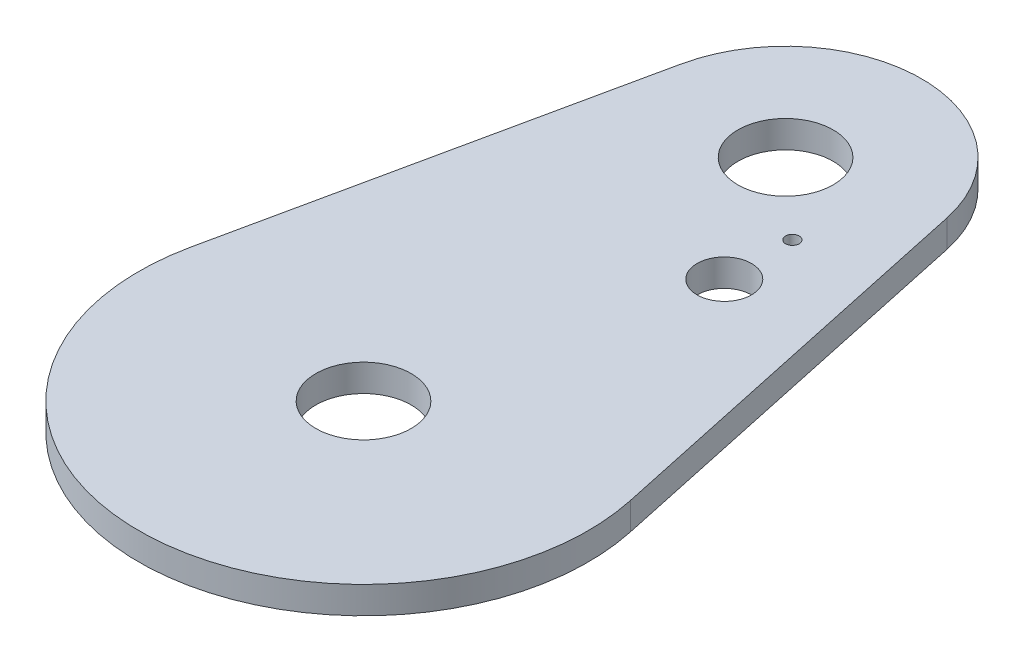
ISO-10303-21;
HEADER;
FILE_DESCRIPTION(('STEP AP214'),'2;1');
FILE_NAME('part.step','',(''),(''),'','','');
FILE_SCHEMA(('AUTOMOTIVE_DESIGN { 1 0 10303 214 1 1 1 1 }'));
ENDSEC;
DATA;
#1=APPLICATION_CONTEXT('core data for automotive mechanical design processes');
#2=APPLICATION_PROTOCOL_DEFINITION('international standard','automotive_design',2000,#1);
#3=PRODUCT_CONTEXT('',#1,'mechanical');
#4=PRODUCT('Part','Part','',(#3));
#5=PRODUCT_RELATED_PRODUCT_CATEGORY('part','',(#4));
#6=PRODUCT_DEFINITION_FORMATION('','',#4);
#7=PRODUCT_DEFINITION_CONTEXT('part definition',#1,'design');
#8=PRODUCT_DEFINITION('design','',#6,#7);
#9=PRODUCT_DEFINITION_SHAPE('','',#8);
#10=(LENGTH_UNIT() NAMED_UNIT(*) SI_UNIT(.MILLI.,.METRE.));
#11=(NAMED_UNIT(*) PLANE_ANGLE_UNIT() SI_UNIT($,.RADIAN.));
#12=(NAMED_UNIT(*) SI_UNIT($,.STERADIAN.) SOLID_ANGLE_UNIT());
#13=UNCERTAINTY_MEASURE_WITH_UNIT(LENGTH_MEASURE(1.E-05),#10,'distance_accuracy_value','');
#14=(GEOMETRIC_REPRESENTATION_CONTEXT(3) GLOBAL_UNCERTAINTY_ASSIGNED_CONTEXT((#13)) GLOBAL_UNIT_ASSIGNED_CONTEXT((#10,
#11,#12)) REPRESENTATION_CONTEXT('',''));
#15=CARTESIAN_POINT('',(0.,0.,0.));
#16=DIRECTION('',(0.,0.,1.));
#17=DIRECTION('',(1.,0.,0.));
#18=AXIS2_PLACEMENT_3D('',#15,#16,#17);
#19=CARTESIAN_POINT('',(0.,-4.,-62.));
#20=DIRECTION('',(0.,1.,0.));
#21=DIRECTION('',(0.,0.,1.));
#22=AXIS2_PLACEMENT_3D('',#19,#20,#21);
#23=CYLINDRICAL_SURFACE('',#22,20.);
#24=CARTESIAN_POINT('',(0.,0.,-62.));
#25=DIRECTION('',(0.,1.,0.));
#26=DIRECTION('',(0.,0.,1.));
#27=AXIS2_PLACEMENT_3D('',#24,#25,#26);
#28=CIRCLE('',#27,20.);
#29=CARTESIAN_POINT('',(19.5554123435196,0.,-66.1935483870968));
#30=VERTEX_POINT('',#29);
#31=CARTESIAN_POINT('',(-19.5554123435196,0.,-66.1935483870968));
#32=VERTEX_POINT('',#31);
#33=EDGE_CURVE('E100',#30,#32,#28,.T.);
#34=ORIENTED_EDGE('',*,*,#33,.F.);
#35=DIRECTION('',(0.,1.,0.));
#36=VECTOR('',#35,1.);
#37=CARTESIAN_POINT('',(19.5554123435196,-4.,-66.1935483870968));
#38=LINE('',#37,#36);
#39=CARTESIAN_POINT('',(19.5554123435196,-4.,-66.1935483870968));
#40=VERTEX_POINT('',#39);
#41=EDGE_CURVE('E11',#40,#30,#38,.T.);
#42=ORIENTED_EDGE('',*,*,#41,.F.);
#43=CARTESIAN_POINT('',(0.,-4.,-62.));
#44=DIRECTION('',(0.,1.,0.));
#45=DIRECTION('',(0.,0.,1.));
#46=AXIS2_PLACEMENT_3D('',#43,#44,#45);
#47=CIRCLE('',#46,20.);
#48=CARTESIAN_POINT('',(-19.5554123435196,-4.,-66.1935483870968));
#49=VERTEX_POINT('',#48);
#50=EDGE_CURVE('E93',#40,#49,#47,.T.);
#51=ORIENTED_EDGE('',*,*,#50,.T.);
#52=DIRECTION('',(0.,1.,0.));
#53=VECTOR('',#52,1.);
#54=CARTESIAN_POINT('',(-19.5554123435196,-4.,-66.1935483870968));
#55=LINE('',#54,#53);
#56=EDGE_CURVE('E38',#49,#32,#55,.T.);
#57=ORIENTED_EDGE('',*,*,#56,.T.);
#58=EDGE_LOOP('',(#34,#42,#51,#57));
#59=FACE_BOUND('',#58,.T.);
#60=ADVANCED_FACE('F35',(#59),#23,.T.);
#61=CARTESIAN_POINT('',(19.5554123435196,-4.,-66.1935483870968));
#62=DIRECTION('',(0.977770617175979,0.,-0.209677419354839));
#63=DIRECTION('',(-0.209677419354839,0.,-0.977770617175979));
#64=AXIS2_PLACEMENT_3D('',#61,#62,#63);
#65=PLANE('',#64);
#66=DIRECTION('',(-0.209677419354839,0.,-0.977770617175979));
#67=VECTOR('',#66,1.);
#68=CARTESIAN_POINT('',(19.5554123435196,0.,-66.1935483870968));
#69=LINE('',#68,#67);
#70=CARTESIAN_POINT('',(32.2664303668073,0.,-6.91935483870969));
#71=VERTEX_POINT('',#70);
#72=EDGE_CURVE('E95',#71,#30,#69,.T.);
#73=ORIENTED_EDGE('',*,*,#72,.F.);
#74=DIRECTION('',(0.,1.,0.));
#75=VECTOR('',#74,1.);
#76=CARTESIAN_POINT('',(32.2664303668073,-4.,-6.91935483870969));
#77=LINE('',#76,#75);
#78=CARTESIAN_POINT('',(32.2664303668073,-4.,-6.91935483870969));
#79=VERTEX_POINT('',#78);
#80=EDGE_CURVE('E44',#79,#71,#77,.T.);
#81=ORIENTED_EDGE('',*,*,#80,.F.);
#82=DIRECTION('',(-0.209677419354839,0.,-0.977770617175979));
#83=VECTOR('',#82,1.);
#84=CARTESIAN_POINT('',(19.5554123435196,-4.,-66.1935483870968));
#85=LINE('',#84,#83);
#86=EDGE_CURVE('E90',#79,#40,#85,.T.);
#87=ORIENTED_EDGE('',*,*,#86,.T.);
#88=ORIENTED_EDGE('',*,*,#41,.T.);
#89=EDGE_LOOP('',(#73,#81,#87,#88));
#90=FACE_BOUND('',#89,.T.);
#91=ADVANCED_FACE('F111',(#90),#65,.T.);
#92=CARTESIAN_POINT('',(0.,-4.,0.));
#93=DIRECTION('',(0.,1.,0.));
#94=DIRECTION('',(0.,0.,1.));
#95=AXIS2_PLACEMENT_3D('',#92,#93,#94);
#96=CYLINDRICAL_SURFACE('',#95,33.);
#97=CARTESIAN_POINT('',(0.,0.,0.));
#98=DIRECTION('',(0.,1.,0.));
#99=DIRECTION('',(0.,0.,1.));
#100=AXIS2_PLACEMENT_3D('',#97,#98,#99);
#101=CIRCLE('',#100,33.);
#102=CARTESIAN_POINT('',(-32.2664303668073,0.,-6.91935483870968));
#103=VERTEX_POINT('',#102);
#104=EDGE_CURVE('E85',#103,#71,#101,.T.);
#105=ORIENTED_EDGE('',*,*,#104,.F.);
#106=DIRECTION('',(0.,1.,0.));
#107=VECTOR('',#106,1.);
#108=CARTESIAN_POINT('',(-32.2664303668073,-4.,-6.91935483870968));
#109=LINE('',#108,#107);
#110=CARTESIAN_POINT('',(-32.2664303668073,-4.,-6.91935483870968));
#111=VERTEX_POINT('',#110);
#112=EDGE_CURVE('E80',#111,#103,#109,.T.);
#113=ORIENTED_EDGE('',*,*,#112,.F.);
#114=CARTESIAN_POINT('',(0.,-4.,0.));
#115=DIRECTION('',(0.,1.,0.));
#116=DIRECTION('',(0.,0.,1.));
#117=AXIS2_PLACEMENT_3D('',#114,#115,#116);
#118=CIRCLE('',#117,33.);
#119=EDGE_CURVE('E83',#111,#79,#118,.T.);
#120=ORIENTED_EDGE('',*,*,#119,.T.);
#121=ORIENTED_EDGE('',*,*,#80,.T.);
#122=EDGE_LOOP('',(#105,#113,#120,#121));
#123=FACE_BOUND('',#122,.T.);
#124=ADVANCED_FACE('F82',(#123),#96,.T.);
#125=CARTESIAN_POINT('',(-19.5554123435196,-4.,-66.1935483870968));
#126=DIRECTION('',(-0.977770617175979,0.,-0.209677419354839));
#127=DIRECTION('',(-0.209677419354839,0.,0.977770617175979));
#128=AXIS2_PLACEMENT_3D('',#125,#126,#127);
#129=PLANE('',#128);
#130=DIRECTION('',(-0.209677419354839,0.,0.977770617175979));
#131=VECTOR('',#130,1.);
#132=CARTESIAN_POINT('',(-19.5554123435196,0.,-66.1935483870968));
#133=LINE('',#132,#131);
#134=EDGE_CURVE('E103',#32,#103,#133,.T.);
#135=ORIENTED_EDGE('',*,*,#134,.F.);
#136=ORIENTED_EDGE('',*,*,#56,.F.);
#137=DIRECTION('',(-0.209677419354839,0.,0.977770617175979));
#138=VECTOR('',#137,1.);
#139=CARTESIAN_POINT('',(-19.5554123435196,-4.,-66.1935483870968));
#140=LINE('',#139,#138);
#141=EDGE_CURVE('E89',#49,#111,#140,.T.);
#142=ORIENTED_EDGE('',*,*,#141,.T.);
#143=ORIENTED_EDGE('',*,*,#112,.T.);
#144=EDGE_LOOP('',(#135,#136,#142,#143));
#145=FACE_BOUND('',#144,.T.);
#146=ADVANCED_FACE('F92',(#145),#129,.T.);
#147=CARTESIAN_POINT('',(0.,-4.,-62.));
#148=DIRECTION('',(0.,1.,0.));
#149=DIRECTION('',(0.,0.,1.));
#150=AXIS2_PLACEMENT_3D('',#147,#148,#149);
#151=PLANE('',#150);
#152=CARTESIAN_POINT('',(11.,-4.,-42.));
#153=DIRECTION('',(0.,1.,0.));
#154=DIRECTION('',(0.,0.,1.));
#155=AXIS2_PLACEMENT_3D('',#152,#153,#154);
#156=CIRCLE('',#155,4.);
#157=CARTESIAN_POINT('',(11.,-4.,-38.));
#158=VERTEX_POINT('',#157);
#159=EDGE_CURVE('E152',#158,#158,#156,.T.);
#160=ORIENTED_EDGE('',*,*,#159,.T.);
#161=EDGE_LOOP('',(#160));
#162=FACE_BOUND('',#161,.T.);
#163=CARTESIAN_POINT('',(11.,-4.,-52.));
#164=DIRECTION('',(0.,1.,0.));
#165=DIRECTION('',(0.,0.,1.));
#166=AXIS2_PLACEMENT_3D('',#163,#164,#165);
#167=CIRCLE('',#166,1.);
#168=CARTESIAN_POINT('',(11.,-4.,-51.));
#169=VERTEX_POINT('',#168);
#170=EDGE_CURVE('E160',#169,#169,#167,.T.);
#171=ORIENTED_EDGE('',*,*,#170,.T.);
#172=EDGE_LOOP('',(#171));
#173=FACE_BOUND('',#172,.T.);
#174=CARTESIAN_POINT('',(0.,-4.,-62.));
#175=DIRECTION('',(0.,1.,0.));
#176=DIRECTION('',(0.,0.,1.));
#177=AXIS2_PLACEMENT_3D('',#174,#175,#176);
#178=CIRCLE('',#177,7.);
#179=CARTESIAN_POINT('',(0.,-4.,-55.));
#180=VERTEX_POINT('',#179);
#181=EDGE_CURVE('E166',#180,#180,#178,.T.);
#182=ORIENTED_EDGE('',*,*,#181,.T.);
#183=EDGE_LOOP('',(#182));
#184=FACE_BOUND('',#183,.T.);
#185=CARTESIAN_POINT('',(0.,-4.,0.));
#186=DIRECTION('',(0.,1.,0.));
#187=DIRECTION('',(0.,0.,1.));
#188=AXIS2_PLACEMENT_3D('',#185,#186,#187);
#189=CIRCLE('',#188,7.);
#190=CARTESIAN_POINT('',(0.,-4.,7.));
#191=VERTEX_POINT('',#190);
#192=EDGE_CURVE('E104',#191,#191,#189,.T.);
#193=ORIENTED_EDGE('',*,*,#192,.T.);
#194=EDGE_LOOP('',(#193));
#195=FACE_BOUND('',#194,.T.);
#196=ORIENTED_EDGE('',*,*,#50,.F.);
#197=ORIENTED_EDGE('',*,*,#86,.F.);
#198=ORIENTED_EDGE('',*,*,#119,.F.);
#199=ORIENTED_EDGE('',*,*,#141,.F.);
#200=EDGE_LOOP('',(#196,#197,#198,#199));
#201=FACE_BOUND('',#200,.T.);
#202=ADVANCED_FACE('F88',(#162,#173,#184,#195,#201),#151,.F.);
#203=CARTESIAN_POINT('',(0.,0.,-62.));
#204=DIRECTION('',(0.,1.,0.));
#205=DIRECTION('',(0.,0.,1.));
#206=AXIS2_PLACEMENT_3D('',#203,#204,#205);
#207=PLANE('',#206);
#208=CARTESIAN_POINT('',(11.,0.,-42.));
#209=DIRECTION('',(0.,1.,0.));
#210=DIRECTION('',(0.,0.,1.));
#211=AXIS2_PLACEMENT_3D('',#208,#209,#210);
#212=CIRCLE('',#211,4.);
#213=CARTESIAN_POINT('',(11.,0.,-38.));
#214=VERTEX_POINT('',#213);
#215=EDGE_CURVE('E155',#214,#214,#212,.T.);
#216=ORIENTED_EDGE('',*,*,#215,.F.);
#217=EDGE_LOOP('',(#216));
#218=FACE_BOUND('',#217,.T.);
#219=CARTESIAN_POINT('',(11.,0.,-52.));
#220=DIRECTION('',(0.,1.,0.));
#221=DIRECTION('',(0.,0.,1.));
#222=AXIS2_PLACEMENT_3D('',#219,#220,#221);
#223=CIRCLE('',#222,1.);
#224=CARTESIAN_POINT('',(11.,0.,-51.));
#225=VERTEX_POINT('',#224);
#226=EDGE_CURVE('E157',#225,#225,#223,.T.);
#227=ORIENTED_EDGE('',*,*,#226,.F.);
#228=EDGE_LOOP('',(#227));
#229=FACE_BOUND('',#228,.T.);
#230=CARTESIAN_POINT('',(0.,0.,-62.));
#231=DIRECTION('',(0.,1.,0.));
#232=DIRECTION('',(0.,0.,1.));
#233=AXIS2_PLACEMENT_3D('',#230,#231,#232);
#234=CIRCLE('',#233,7.);
#235=CARTESIAN_POINT('',(0.,0.,-55.));
#236=VERTEX_POINT('',#235);
#237=EDGE_CURVE('E163',#236,#236,#234,.T.);
#238=ORIENTED_EDGE('',*,*,#237,.F.);
#239=EDGE_LOOP('',(#238));
#240=FACE_BOUND('',#239,.T.);
#241=CARTESIAN_POINT('',(0.,0.,0.));
#242=DIRECTION('',(0.,1.,0.));
#243=DIRECTION('',(0.,0.,1.));
#244=AXIS2_PLACEMENT_3D('',#241,#242,#243);
#245=CIRCLE('',#244,7.);
#246=CARTESIAN_POINT('',(0.,0.,7.));
#247=VERTEX_POINT('',#246);
#248=EDGE_CURVE('E169',#247,#247,#245,.T.);
#249=ORIENTED_EDGE('',*,*,#248,.F.);
#250=EDGE_LOOP('',(#249));
#251=FACE_BOUND('',#250,.T.);
#252=ORIENTED_EDGE('',*,*,#33,.T.);
#253=ORIENTED_EDGE('',*,*,#134,.T.);
#254=ORIENTED_EDGE('',*,*,#104,.T.);
#255=ORIENTED_EDGE('',*,*,#72,.T.);
#256=EDGE_LOOP('',(#252,#253,#254,#255));
#257=FACE_BOUND('',#256,.T.);
#258=ADVANCED_FACE('F110',(#218,#229,#240,#251,#257),#207,.T.);
#259=CARTESIAN_POINT('',(0.,-4.,0.));
#260=DIRECTION('',(0.,1.,0.));
#261=DIRECTION('',(0.,0.,1.));
#262=AXIS2_PLACEMENT_3D('',#259,#260,#261);
#263=CYLINDRICAL_SURFACE('',#262,7.);
#264=ORIENTED_EDGE('',*,*,#192,.F.);
#265=EDGE_LOOP('',(#264));
#266=FACE_BOUND('',#265,.T.);
#267=ORIENTED_EDGE('',*,*,#248,.T.);
#268=EDGE_LOOP('',(#267));
#269=FACE_BOUND('',#268,.T.);
#270=ADVANCED_FACE('F129',(#266,#269),#263,.F.);
#271=CARTESIAN_POINT('',(0.,-4.,-62.));
#272=DIRECTION('',(0.,1.,0.));
#273=DIRECTION('',(0.,0.,1.));
#274=AXIS2_PLACEMENT_3D('',#271,#272,#273);
#275=CYLINDRICAL_SURFACE('',#274,7.);
#276=ORIENTED_EDGE('',*,*,#181,.F.);
#277=EDGE_LOOP('',(#276));
#278=FACE_BOUND('',#277,.T.);
#279=ORIENTED_EDGE('',*,*,#237,.T.);
#280=EDGE_LOOP('',(#279));
#281=FACE_BOUND('',#280,.T.);
#282=ADVANCED_FACE('F136',(#278,#281),#275,.F.);
#283=CARTESIAN_POINT('',(11.,-4.,-52.));
#284=DIRECTION('',(0.,1.,0.));
#285=DIRECTION('',(0.,0.,1.));
#286=AXIS2_PLACEMENT_3D('',#283,#284,#285);
#287=CYLINDRICAL_SURFACE('',#286,1.);
#288=ORIENTED_EDGE('',*,*,#170,.F.);
#289=EDGE_LOOP('',(#288));
#290=FACE_BOUND('',#289,.T.);
#291=ORIENTED_EDGE('',*,*,#226,.T.);
#292=EDGE_LOOP('',(#291));
#293=FACE_BOUND('',#292,.T.);
#294=ADVANCED_FACE('F140',(#290,#293),#287,.F.);
#295=CARTESIAN_POINT('',(11.,-4.,-42.));
#296=DIRECTION('',(0.,1.,0.));
#297=DIRECTION('',(0.,0.,1.));
#298=AXIS2_PLACEMENT_3D('',#295,#296,#297);
#299=CYLINDRICAL_SURFACE('',#298,4.);
#300=ORIENTED_EDGE('',*,*,#159,.F.);
#301=EDGE_LOOP('',(#300));
#302=FACE_BOUND('',#301,.T.);
#303=ORIENTED_EDGE('',*,*,#215,.T.);
#304=EDGE_LOOP('',(#303));
#305=FACE_BOUND('',#304,.T.);
#306=ADVANCED_FACE('F144',(#302,#305),#299,.F.);
#307=CLOSED_SHELL('',(#60,#91,#124,#146,#202,#258,#270,#282,#294,#306));
#308=MANIFOLD_SOLID_BREP('B2',#307);
#309=ADVANCED_BREP_SHAPE_REPRESENTATION('',(#18,#308),#14);
#310=SHAPE_DEFINITION_REPRESENTATION(#9,#309);
ENDSEC;
END-ISO-10303-21;
